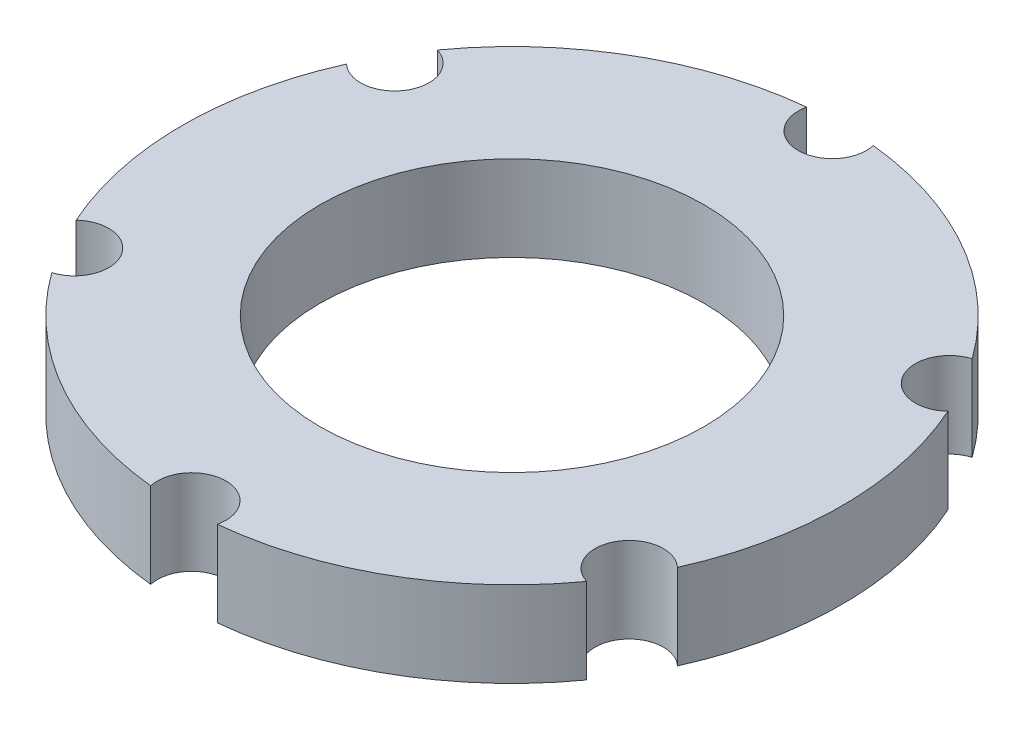
ISO-10303-21;
HEADER;
FILE_DESCRIPTION(('STEP AP214'),'2;1');
FILE_NAME('part.step','',(''),(''),'','','');
FILE_SCHEMA(('AUTOMOTIVE_DESIGN { 1 0 10303 214 1 1 1 1 }'));
ENDSEC;
DATA;
#1=APPLICATION_CONTEXT('core data for automotive mechanical design processes');
#2=APPLICATION_PROTOCOL_DEFINITION('international standard','automotive_design',2000,#1);
#3=PRODUCT_CONTEXT('',#1,'mechanical');
#4=PRODUCT('Part','Part','',(#3));
#5=PRODUCT_RELATED_PRODUCT_CATEGORY('part','',(#4));
#6=PRODUCT_DEFINITION_FORMATION('','',#4);
#7=PRODUCT_DEFINITION_CONTEXT('part definition',#1,'design');
#8=PRODUCT_DEFINITION('design','',#6,#7);
#9=PRODUCT_DEFINITION_SHAPE('','',#8);
#10=(LENGTH_UNIT() NAMED_UNIT(*) SI_UNIT(.MILLI.,.METRE.));
#11=(NAMED_UNIT(*) PLANE_ANGLE_UNIT() SI_UNIT($,.RADIAN.));
#12=(NAMED_UNIT(*) SI_UNIT($,.STERADIAN.) SOLID_ANGLE_UNIT());
#13=UNCERTAINTY_MEASURE_WITH_UNIT(LENGTH_MEASURE(1.E-05),#10,'distance_accuracy_value','');
#14=(GEOMETRIC_REPRESENTATION_CONTEXT(3) GLOBAL_UNCERTAINTY_ASSIGNED_CONTEXT((#13)) GLOBAL_UNIT_ASSIGNED_CONTEXT((#10,
#11,#12)) REPRESENTATION_CONTEXT('',''));
#15=CARTESIAN_POINT('',(0.,0.,0.));
#16=DIRECTION('',(0.,0.,1.));
#17=DIRECTION('',(1.,0.,0.));
#18=AXIS2_PLACEMENT_3D('',#15,#16,#17);
#19=CARTESIAN_POINT('',(0.,6.35,0.));
#20=DIRECTION('',(0.,1.,0.));
#21=DIRECTION('',(0.,0.,1.));
#22=AXIS2_PLACEMENT_3D('',#19,#20,#21);
#23=PLANE('',#22);
#24=CARTESIAN_POINT('',(0.,6.35,0.));
#25=DIRECTION('',(0.,1.,0.));
#26=DIRECTION('',(0.,0.,1.));
#27=AXIS2_PLACEMENT_3D('',#24,#25,#26);
#28=CIRCLE('',#27,14.2875);
#29=CARTESIAN_POINT('',(0.,6.35,14.2875));
#30=VERTEX_POINT('',#29);
#31=EDGE_CURVE('E171',#30,#30,#28,.T.);
#32=ORIENTED_EDGE('',*,*,#31,.F.);
#33=EDGE_LOOP('',(#32));
#34=FACE_BOUND('',#33,.T.);
#35=CARTESIAN_POINT('',(0.,6.35,23.8125));
#36=DIRECTION('',(0.,1.,0.));
#37=DIRECTION('',(0.,0.,1.));
#38=AXIS2_PLACEMENT_3D('',#35,#36,#37);
#39=CIRCLE('',#38,2.54);
#40=CARTESIAN_POINT('',(2.47446000871221,6.35,24.385778));
#41=VERTEX_POINT('',#40);
#42=CARTESIAN_POINT('',(-2.4744600087122,6.35,24.385778));
#43=VERTEX_POINT('',#42);
#44=EDGE_CURVE('E153',#41,#43,#39,.T.);
#45=ORIENTED_EDGE('',*,*,#44,.F.);
#46=CARTESIAN_POINT('',(0.,6.35,0.));
#47=DIRECTION('',(0.,1.,0.));
#48=DIRECTION('',(0.,0.,1.));
#49=AXIS2_PLACEMENT_3D('',#46,#47,#48);
#50=CIRCLE('',#49,24.511);
#51=CARTESIAN_POINT('',(19.8814732346916,6.35,14.3358342281934));
#52=VERTEX_POINT('',#51);
#53=EDGE_CURVE('E63',#41,#52,#50,.T.);
#54=ORIENTED_EDGE('',*,*,#53,.T.);
#55=CARTESIAN_POINT('',(20.6222299276169,6.35,11.90625));
#56=DIRECTION('',(0.,1.,0.));
#57=DIRECTION('',(0.,0.,1.));
#58=AXIS2_PLACEMENT_3D('',#55,#56,#57);
#59=CIRCLE('',#58,2.54);
#60=CARTESIAN_POINT('',(22.3559332434038,6.35,10.0499437718066));
#61=VERTEX_POINT('',#60);
#62=EDGE_CURVE('E215',#61,#52,#59,.T.);
#63=ORIENTED_EDGE('',*,*,#62,.F.);
#64=CARTESIAN_POINT('',(22.3559332434038,6.35,-10.0499437718066));
#65=VERTEX_POINT('',#64);
#66=EDGE_CURVE('E252',#61,#65,#50,.T.);
#67=ORIENTED_EDGE('',*,*,#66,.T.);
#68=CARTESIAN_POINT('',(20.6222299276169,6.35,-11.90625));
#69=DIRECTION('',(0.,1.,0.));
#70=DIRECTION('',(0.,0.,1.));
#71=AXIS2_PLACEMENT_3D('',#68,#69,#70);
#72=CIRCLE('',#71,2.54);
#73=CARTESIAN_POINT('',(19.8814732346916,6.35,-14.3358342281934));
#74=VERTEX_POINT('',#73);
#75=EDGE_CURVE('E164',#74,#65,#72,.T.);
#76=ORIENTED_EDGE('',*,*,#75,.F.);
#77=CARTESIAN_POINT('',(2.4744600087122,6.35,-24.385778));
#78=VERTEX_POINT('',#77);
#79=EDGE_CURVE('E259',#74,#78,#50,.T.);
#80=ORIENTED_EDGE('',*,*,#79,.T.);
#81=CARTESIAN_POINT('',(0.,6.35,-23.8125));
#82=DIRECTION('',(0.,1.,0.));
#83=DIRECTION('',(0.,0.,1.));
#84=AXIS2_PLACEMENT_3D('',#81,#82,#83);
#85=CIRCLE('',#84,2.54);
#86=CARTESIAN_POINT('',(-2.47446000871221,6.35,-24.385778));
#87=VERTEX_POINT('',#86);
#88=EDGE_CURVE('E152',#87,#78,#85,.T.);
#89=ORIENTED_EDGE('',*,*,#88,.F.);
#90=CARTESIAN_POINT('',(-19.8814732346916,6.35,-14.3358342281934));
#91=VERTEX_POINT('',#90);
#92=EDGE_CURVE('E186',#87,#91,#50,.T.);
#93=ORIENTED_EDGE('',*,*,#92,.T.);
#94=CARTESIAN_POINT('',(-20.6222299276169,6.35,-11.90625));
#95=DIRECTION('',(0.,1.,0.));
#96=DIRECTION('',(0.,0.,1.));
#97=AXIS2_PLACEMENT_3D('',#94,#95,#96);
#98=CIRCLE('',#97,2.54);
#99=CARTESIAN_POINT('',(-22.3559332434038,6.35,-10.0499437718066));
#100=VERTEX_POINT('',#99);
#101=EDGE_CURVE('E214',#100,#91,#98,.T.);
#102=ORIENTED_EDGE('',*,*,#101,.F.);
#103=CARTESIAN_POINT('',(-22.3559332434038,6.35,10.0499437718066));
#104=VERTEX_POINT('',#103);
#105=EDGE_CURVE('E262',#100,#104,#50,.T.);
#106=ORIENTED_EDGE('',*,*,#105,.T.);
#107=CARTESIAN_POINT('',(-20.6222299276169,6.35,11.90625));
#108=DIRECTION('',(0.,1.,0.));
#109=DIRECTION('',(0.,0.,1.));
#110=AXIS2_PLACEMENT_3D('',#107,#108,#109);
#111=CIRCLE('',#110,2.54);
#112=CARTESIAN_POINT('',(-19.8814732346916,6.35,14.3358342281934));
#113=VERTEX_POINT('',#112);
#114=EDGE_CURVE('E205',#113,#104,#111,.T.);
#115=ORIENTED_EDGE('',*,*,#114,.F.);
#116=EDGE_CURVE('E253',#113,#43,#50,.T.);
#117=ORIENTED_EDGE('',*,*,#116,.T.);
#118=EDGE_LOOP('',(#45,#54,#63,#67,#76,#80,#89,#93,#102,#106,#115,#117));
#119=FACE_BOUND('',#118,.T.);
#120=ADVANCED_FACE('F39',(#34,#119),#23,.T.);
#121=CARTESIAN_POINT('',(0.,0.,0.));
#122=DIRECTION('',(0.,1.,0.));
#123=DIRECTION('',(0.,0.,1.));
#124=AXIS2_PLACEMENT_3D('',#121,#122,#123);
#125=PLANE('',#124);
#126=CARTESIAN_POINT('',(0.,0.,0.));
#127=DIRECTION('',(0.,1.,0.));
#128=DIRECTION('',(0.,0.,1.));
#129=AXIS2_PLACEMENT_3D('',#126,#127,#128);
#130=CIRCLE('',#129,14.2875);
#131=CARTESIAN_POINT('',(0.,0.,14.2875));
#132=VERTEX_POINT('',#131);
#133=EDGE_CURVE('E175',#132,#132,#130,.T.);
#134=ORIENTED_EDGE('',*,*,#133,.T.);
#135=EDGE_LOOP('',(#134));
#136=FACE_BOUND('',#135,.T.);
#137=CARTESIAN_POINT('',(0.,0.,0.));
#138=DIRECTION('',(0.,1.,0.));
#139=DIRECTION('',(0.,0.,1.));
#140=AXIS2_PLACEMENT_3D('',#137,#138,#139);
#141=CIRCLE('',#140,24.511);
#142=CARTESIAN_POINT('',(2.4744600087122,0.,24.385778));
#143=VERTEX_POINT('',#142);
#144=CARTESIAN_POINT('',(19.8814732346916,0.,14.3358342281934));
#145=VERTEX_POINT('',#144);
#146=EDGE_CURVE('E128',#143,#145,#141,.T.);
#147=ORIENTED_EDGE('',*,*,#146,.F.);
#148=CARTESIAN_POINT('',(0.,0.,23.8125));
#149=DIRECTION('',(0.,1.,0.));
#150=DIRECTION('',(0.,0.,1.));
#151=AXIS2_PLACEMENT_3D('',#148,#149,#150);
#152=CIRCLE('',#151,2.54);
#153=CARTESIAN_POINT('',(-2.4744600087122,0.,24.385778));
#154=VERTEX_POINT('',#153);
#155=EDGE_CURVE('E142',#154,#143,#152,.F.);
#156=ORIENTED_EDGE('',*,*,#155,.F.);
#157=CARTESIAN_POINT('',(-19.8814732346916,0.,14.3358342281934));
#158=VERTEX_POINT('',#157);
#159=EDGE_CURVE('E148',#158,#154,#141,.T.);
#160=ORIENTED_EDGE('',*,*,#159,.F.);
#161=CARTESIAN_POINT('',(-20.6222299276169,0.,11.90625));
#162=DIRECTION('',(0.,1.,0.));
#163=DIRECTION('',(0.,0.,1.));
#164=AXIS2_PLACEMENT_3D('',#161,#162,#163);
#165=CIRCLE('',#164,2.54);
#166=CARTESIAN_POINT('',(-22.3559332434038,0.,10.0499437718066));
#167=VERTEX_POINT('',#166);
#168=EDGE_CURVE('E209',#167,#158,#165,.F.);
#169=ORIENTED_EDGE('',*,*,#168,.F.);
#170=CARTESIAN_POINT('',(-22.3559332434038,0.,-10.0499437718066));
#171=VERTEX_POINT('',#170);
#172=EDGE_CURVE('E198',#171,#167,#141,.T.);
#173=ORIENTED_EDGE('',*,*,#172,.F.);
#174=CARTESIAN_POINT('',(-20.6222299276169,0.,-11.90625));
#175=DIRECTION('',(0.,1.,0.));
#176=DIRECTION('',(0.,0.,1.));
#177=AXIS2_PLACEMENT_3D('',#174,#175,#176);
#178=CIRCLE('',#177,2.54);
#179=CARTESIAN_POINT('',(-19.8814732346916,0.,-14.3358342281934));
#180=VERTEX_POINT('',#179);
#181=EDGE_CURVE('E195',#180,#171,#178,.F.);
#182=ORIENTED_EDGE('',*,*,#181,.F.);
#183=CARTESIAN_POINT('',(-2.4744600087122,0.,-24.385778));
#184=VERTEX_POINT('',#183);
#185=EDGE_CURVE('E183',#184,#180,#141,.T.);
#186=ORIENTED_EDGE('',*,*,#185,.F.);
#187=CARTESIAN_POINT('',(0.,0.,-23.8125));
#188=DIRECTION('',(0.,1.,0.));
#189=DIRECTION('',(0.,0.,1.));
#190=AXIS2_PLACEMENT_3D('',#187,#188,#189);
#191=CIRCLE('',#190,2.54);
#192=CARTESIAN_POINT('',(2.47446000871221,0.,-24.385778));
#193=VERTEX_POINT('',#192);
#194=EDGE_CURVE('E158',#193,#184,#191,.F.);
#195=ORIENTED_EDGE('',*,*,#194,.F.);
#196=CARTESIAN_POINT('',(19.8814732346916,0.,-14.3358342281934));
#197=VERTEX_POINT('',#196);
#198=EDGE_CURVE('E197',#197,#193,#141,.T.);
#199=ORIENTED_EDGE('',*,*,#198,.F.);
#200=CARTESIAN_POINT('',(20.6222299276169,0.,-11.90625));
#201=DIRECTION('',(0.,1.,0.));
#202=DIRECTION('',(0.,0.,1.));
#203=AXIS2_PLACEMENT_3D('',#200,#201,#202);
#204=CIRCLE('',#203,2.54);
#205=CARTESIAN_POINT('',(22.3559332434038,0.,-10.0499437718066));
#206=VERTEX_POINT('',#205);
#207=EDGE_CURVE('E160',#206,#197,#204,.F.);
#208=ORIENTED_EDGE('',*,*,#207,.F.);
#209=CARTESIAN_POINT('',(22.3559332434038,0.,10.0499437718066));
#210=VERTEX_POINT('',#209);
#211=EDGE_CURVE('E55',#210,#206,#141,.T.);
#212=ORIENTED_EDGE('',*,*,#211,.F.);
#213=CARTESIAN_POINT('',(20.6222299276169,0.,11.90625));
#214=DIRECTION('',(0.,1.,0.));
#215=DIRECTION('',(0.,0.,1.));
#216=AXIS2_PLACEMENT_3D('',#213,#214,#215);
#217=CIRCLE('',#216,2.54);
#218=EDGE_CURVE('E144',#145,#210,#217,.F.);
#219=ORIENTED_EDGE('',*,*,#218,.F.);
#220=EDGE_LOOP('',(#147,#156,#160,#169,#173,#182,#186,#195,#199,#208,#212,#219));
#221=FACE_BOUND('',#220,.T.);
#222=ADVANCED_FACE('F41',(#136,#221),#125,.F.);
#223=CARTESIAN_POINT('',(-20.6222299276169,-7.18420489685533,-11.90625));
#224=DIRECTION('',(0.,1.,0.));
#225=DIRECTION('',(0.,0.,1.));
#226=AXIS2_PLACEMENT_3D('',#223,#224,#225);
#227=CYLINDRICAL_SURFACE('',#226,2.54);
#228=DIRECTION('',(0.,1.,0.));
#229=VECTOR('',#228,1.);
#230=CARTESIAN_POINT('',(-19.8814732346916,3.175,-14.3358342281934));
#231=LINE('',#230,#229);
#232=EDGE_CURVE('E210',#180,#91,#231,.T.);
#233=ORIENTED_EDGE('',*,*,#232,.F.);
#234=ORIENTED_EDGE('',*,*,#181,.T.);
#235=DIRECTION('',(0.,1.,0.));
#236=VECTOR('',#235,1.);
#237=CARTESIAN_POINT('',(-22.3559332434038,3.175,-10.0499437718066));
#238=LINE('',#237,#236);
#239=EDGE_CURVE('E227',#100,#171,#238,.F.);
#240=ORIENTED_EDGE('',*,*,#239,.F.);
#241=ORIENTED_EDGE('',*,*,#101,.T.);
#242=EDGE_LOOP('',(#233,#234,#240,#241));
#243=FACE_BOUND('',#242,.T.);
#244=ADVANCED_FACE('F226',(#243),#227,.F.);
#245=CARTESIAN_POINT('',(20.6222299276169,-7.18420489685533,11.90625));
#246=DIRECTION('',(0.,1.,0.));
#247=DIRECTION('',(0.,0.,1.));
#248=AXIS2_PLACEMENT_3D('',#245,#246,#247);
#249=CYLINDRICAL_SURFACE('',#248,2.54);
#250=DIRECTION('',(0.,1.,0.));
#251=VECTOR('',#250,1.);
#252=CARTESIAN_POINT('',(19.8814732346916,3.175,14.3358342281934));
#253=LINE('',#252,#251);
#254=EDGE_CURVE('E231',#145,#52,#253,.T.);
#255=ORIENTED_EDGE('',*,*,#254,.F.);
#256=ORIENTED_EDGE('',*,*,#218,.T.);
#257=DIRECTION('',(0.,1.,0.));
#258=VECTOR('',#257,1.);
#259=CARTESIAN_POINT('',(22.3559332434038,3.175,10.0499437718066));
#260=LINE('',#259,#258);
#261=EDGE_CURVE('E236',#61,#210,#260,.F.);
#262=ORIENTED_EDGE('',*,*,#261,.F.);
#263=ORIENTED_EDGE('',*,*,#62,.T.);
#264=EDGE_LOOP('',(#255,#256,#262,#263));
#265=FACE_BOUND('',#264,.T.);
#266=ADVANCED_FACE('F312',(#265),#249,.F.);
#267=CARTESIAN_POINT('',(20.6222299276169,-7.18420489685533,-11.90625));
#268=DIRECTION('',(0.,1.,0.));
#269=DIRECTION('',(0.,0.,1.));
#270=AXIS2_PLACEMENT_3D('',#267,#268,#269);
#271=CYLINDRICAL_SURFACE('',#270,2.54);
#272=DIRECTION('',(0.,1.,0.));
#273=VECTOR('',#272,1.);
#274=CARTESIAN_POINT('',(22.3559332434038,3.175,-10.0499437718066));
#275=LINE('',#274,#273);
#276=EDGE_CURVE('E239',#206,#65,#275,.T.);
#277=ORIENTED_EDGE('',*,*,#276,.F.);
#278=ORIENTED_EDGE('',*,*,#207,.T.);
#279=DIRECTION('',(0.,1.,0.));
#280=VECTOR('',#279,1.);
#281=CARTESIAN_POINT('',(19.8814732346916,3.175,-14.3358342281934));
#282=LINE('',#281,#280);
#283=EDGE_CURVE('E242',#74,#197,#282,.F.);
#284=ORIENTED_EDGE('',*,*,#283,.F.);
#285=ORIENTED_EDGE('',*,*,#75,.T.);
#286=EDGE_LOOP('',(#277,#278,#284,#285));
#287=FACE_BOUND('',#286,.T.);
#288=ADVANCED_FACE('F274',(#287),#271,.F.);
#289=CARTESIAN_POINT('',(0.,-7.18420489685533,23.8125));
#290=DIRECTION('',(0.,1.,0.));
#291=DIRECTION('',(0.,0.,1.));
#292=AXIS2_PLACEMENT_3D('',#289,#290,#291);
#293=CYLINDRICAL_SURFACE('',#292,2.54);
#294=DIRECTION('',(0.,1.,0.));
#295=VECTOR('',#294,1.);
#296=CARTESIAN_POINT('',(-2.4744600087122,3.175,24.385778));
#297=LINE('',#296,#295);
#298=EDGE_CURVE('E135',#154,#43,#297,.T.);
#299=ORIENTED_EDGE('',*,*,#298,.F.);
#300=ORIENTED_EDGE('',*,*,#155,.T.);
#301=DIRECTION('',(0.,1.,0.));
#302=VECTOR('',#301,1.);
#303=CARTESIAN_POINT('',(2.4744600087122,3.175,24.385778));
#304=LINE('',#303,#302);
#305=EDGE_CURVE('E125',#41,#143,#304,.F.);
#306=ORIENTED_EDGE('',*,*,#305,.F.);
#307=ORIENTED_EDGE('',*,*,#44,.T.);
#308=EDGE_LOOP('',(#299,#300,#306,#307));
#309=FACE_BOUND('',#308,.T.);
#310=ADVANCED_FACE('F150',(#309),#293,.F.);
#311=CARTESIAN_POINT('',(-20.6222299276169,-7.18420489685533,11.90625));
#312=DIRECTION('',(0.,1.,0.));
#313=DIRECTION('',(0.,0.,1.));
#314=AXIS2_PLACEMENT_3D('',#311,#312,#313);
#315=CYLINDRICAL_SURFACE('',#314,2.54);
#316=DIRECTION('',(0.,1.,0.));
#317=VECTOR('',#316,1.);
#318=CARTESIAN_POINT('',(-22.3559332434038,3.175,10.0499437718066));
#319=LINE('',#318,#317);
#320=EDGE_CURVE('E136',#167,#104,#319,.T.);
#321=ORIENTED_EDGE('',*,*,#320,.F.);
#322=ORIENTED_EDGE('',*,*,#168,.T.);
#323=DIRECTION('',(0.,1.,0.));
#324=VECTOR('',#323,1.);
#325=CARTESIAN_POINT('',(-19.8814732346916,3.175,14.3358342281934));
#326=LINE('',#325,#324);
#327=EDGE_CURVE('E146',#113,#158,#326,.F.);
#328=ORIENTED_EDGE('',*,*,#327,.F.);
#329=ORIENTED_EDGE('',*,*,#114,.T.);
#330=EDGE_LOOP('',(#321,#322,#328,#329));
#331=FACE_BOUND('',#330,.T.);
#332=ADVANCED_FACE('F284',(#331),#315,.F.);
#333=CARTESIAN_POINT('',(0.,-7.18420489685533,-23.8125));
#334=DIRECTION('',(0.,1.,0.));
#335=DIRECTION('',(0.,0.,1.));
#336=AXIS2_PLACEMENT_3D('',#333,#334,#335);
#337=CYLINDRICAL_SURFACE('',#336,2.54);
#338=DIRECTION('',(0.,1.,0.));
#339=VECTOR('',#338,1.);
#340=CARTESIAN_POINT('',(2.4744600087122,3.175,-24.385778));
#341=LINE('',#340,#339);
#342=EDGE_CURVE('E11',#193,#78,#341,.T.);
#343=ORIENTED_EDGE('',*,*,#342,.F.);
#344=ORIENTED_EDGE('',*,*,#194,.T.);
#345=DIRECTION('',(0.,1.,0.));
#346=VECTOR('',#345,1.);
#347=CARTESIAN_POINT('',(-2.4744600087122,3.175,-24.385778));
#348=LINE('',#347,#346);
#349=EDGE_CURVE('E48',#87,#184,#348,.F.);
#350=ORIENTED_EDGE('',*,*,#349,.F.);
#351=ORIENTED_EDGE('',*,*,#88,.T.);
#352=EDGE_LOOP('',(#343,#344,#350,#351));
#353=FACE_BOUND('',#352,.T.);
#354=ADVANCED_FACE('F200',(#353),#337,.F.);
#355=CARTESIAN_POINT('',(0.,6.35,0.));
#356=DIRECTION('',(0.,-1.,0.));
#357=DIRECTION('',(0.,0.,-1.));
#358=AXIS2_PLACEMENT_3D('',#355,#356,#357);
#359=CYLINDRICAL_SURFACE('',#358,14.2875);
#360=ORIENTED_EDGE('',*,*,#31,.T.);
#361=EDGE_LOOP('',(#360));
#362=FACE_BOUND('',#361,.T.);
#363=ORIENTED_EDGE('',*,*,#133,.F.);
#364=EDGE_LOOP('',(#363));
#365=FACE_BOUND('',#364,.T.);
#366=ADVANCED_FACE('F297',(#362,#365),#359,.F.);
#367=CARTESIAN_POINT('',(0.,0.,0.));
#368=DIRECTION('',(0.,1.,0.));
#369=DIRECTION('',(0.,0.,1.));
#370=AXIS2_PLACEMENT_3D('',#367,#368,#369);
#371=CYLINDRICAL_SURFACE('',#370,24.511);
#372=ORIENTED_EDGE('',*,*,#232,.T.);
#373=ORIENTED_EDGE('',*,*,#92,.F.);
#374=ORIENTED_EDGE('',*,*,#349,.T.);
#375=ORIENTED_EDGE('',*,*,#185,.T.);
#376=EDGE_LOOP('',(#372,#373,#374,#375));
#377=FACE_BOUND('',#376,.T.);
#378=ADVANCED_FACE('F182',(#377),#371,.T.);
#379=ORIENTED_EDGE('',*,*,#283,.T.);
#380=ORIENTED_EDGE('',*,*,#198,.T.);
#381=ORIENTED_EDGE('',*,*,#342,.T.);
#382=ORIENTED_EDGE('',*,*,#79,.F.);
#383=EDGE_LOOP('',(#379,#380,#381,#382));
#384=FACE_BOUND('',#383,.T.);
#385=ADVANCED_FACE('F272',(#384),#371,.T.);
#386=ORIENTED_EDGE('',*,*,#298,.T.);
#387=ORIENTED_EDGE('',*,*,#116,.F.);
#388=ORIENTED_EDGE('',*,*,#327,.T.);
#389=ORIENTED_EDGE('',*,*,#159,.T.);
#390=EDGE_LOOP('',(#386,#387,#388,#389));
#391=FACE_BOUND('',#390,.T.);
#392=ADVANCED_FACE('F287',(#391),#371,.T.);
#393=ORIENTED_EDGE('',*,*,#239,.T.);
#394=ORIENTED_EDGE('',*,*,#172,.T.);
#395=ORIENTED_EDGE('',*,*,#320,.T.);
#396=ORIENTED_EDGE('',*,*,#105,.F.);
#397=EDGE_LOOP('',(#393,#394,#395,#396));
#398=FACE_BOUND('',#397,.T.);
#399=ADVANCED_FACE('F281',(#398),#371,.T.);
#400=ORIENTED_EDGE('',*,*,#254,.T.);
#401=ORIENTED_EDGE('',*,*,#53,.F.);
#402=ORIENTED_EDGE('',*,*,#305,.T.);
#403=ORIENTED_EDGE('',*,*,#146,.T.);
#404=EDGE_LOOP('',(#400,#401,#402,#403));
#405=FACE_BOUND('',#404,.T.);
#406=ADVANCED_FACE('F127',(#405),#371,.T.);
#407=ORIENTED_EDGE('',*,*,#261,.T.);
#408=ORIENTED_EDGE('',*,*,#211,.T.);
#409=ORIENTED_EDGE('',*,*,#276,.T.);
#410=ORIENTED_EDGE('',*,*,#66,.F.);
#411=EDGE_LOOP('',(#407,#408,#409,#410));
#412=FACE_BOUND('',#411,.T.);
#413=ADVANCED_FACE('F294',(#412),#371,.T.);
#414=CLOSED_SHELL('',(#120,#222,#244,#266,#288,#310,#332,#354,#366,#378,#385,#392,#399,#406,#413));
#415=MANIFOLD_SOLID_BREP('B2',#414);
#416=ADVANCED_BREP_SHAPE_REPRESENTATION('',(#18,#415),#14);
#417=SHAPE_DEFINITION_REPRESENTATION(#9,#416);
ENDSEC;
END-ISO-10303-21;
